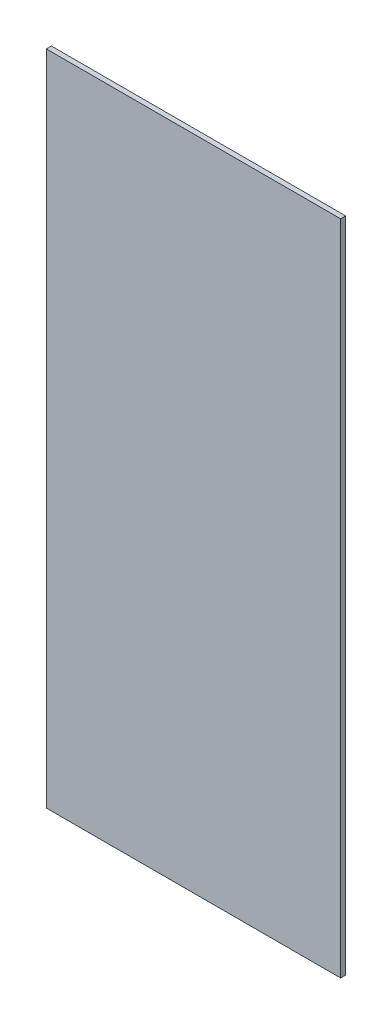
ISO-10303-21;
HEADER;
FILE_DESCRIPTION(('STEP AP214'),'2;1');
FILE_NAME('part.step','',(''),(''),'','','');
FILE_SCHEMA(('AUTOMOTIVE_DESIGN { 1 0 10303 214 1 1 1 1 }'));
ENDSEC;
DATA;
#1=APPLICATION_CONTEXT('core data for automotive mechanical design processes');
#2=APPLICATION_PROTOCOL_DEFINITION('international standard','automotive_design',2000,#1);
#3=PRODUCT_CONTEXT('',#1,'mechanical');
#4=PRODUCT('Part','Part','',(#3));
#5=PRODUCT_RELATED_PRODUCT_CATEGORY('part','',(#4));
#6=PRODUCT_DEFINITION_FORMATION('','',#4);
#7=PRODUCT_DEFINITION_CONTEXT('part definition',#1,'design');
#8=PRODUCT_DEFINITION('design','',#6,#7);
#9=PRODUCT_DEFINITION_SHAPE('','',#8);
#10=(LENGTH_UNIT() NAMED_UNIT(*) SI_UNIT(.MILLI.,.METRE.));
#11=(NAMED_UNIT(*) PLANE_ANGLE_UNIT() SI_UNIT($,.RADIAN.));
#12=(NAMED_UNIT(*) SI_UNIT($,.STERADIAN.) SOLID_ANGLE_UNIT());
#13=UNCERTAINTY_MEASURE_WITH_UNIT(LENGTH_MEASURE(1.E-05),#10,'distance_accuracy_value','');
#14=(GEOMETRIC_REPRESENTATION_CONTEXT(3) GLOBAL_UNCERTAINTY_ASSIGNED_CONTEXT((#13)) GLOBAL_UNIT_ASSIGNED_CONTEXT((#10,
#11,#12)) REPRESENTATION_CONTEXT('',''));
#15=CARTESIAN_POINT('',(0.,0.,0.));
#16=DIRECTION('',(0.,0.,1.));
#17=DIRECTION('',(1.,0.,0.));
#18=AXIS2_PLACEMENT_3D('',#15,#16,#17);
#19=CARTESIAN_POINT('',(-117.5,262.5,4.));
#20=DIRECTION('',(1.,0.,0.));
#21=DIRECTION('',(0.,1.,0.));
#22=AXIS2_PLACEMENT_3D('',#19,#20,#21);
#23=PLANE('',#22);
#24=DIRECTION('',(0.,-1.,0.));
#25=VECTOR('',#24,1.);
#26=CARTESIAN_POINT('',(-117.5,262.5,0.));
#27=LINE('',#26,#25);
#28=CARTESIAN_POINT('',(-117.5,262.5,0.));
#29=VERTEX_POINT('',#28);
#30=CARTESIAN_POINT('',(-117.5,-262.5,0.));
#31=VERTEX_POINT('',#30);
#32=EDGE_CURVE('E91',#29,#31,#27,.T.);
#33=ORIENTED_EDGE('',*,*,#32,.T.);
#34=DIRECTION('',(0.,0.,-1.));
#35=VECTOR('',#34,1.);
#36=CARTESIAN_POINT('',(-117.5,-262.5,4.));
#37=LINE('',#36,#35);
#38=CARTESIAN_POINT('',(-117.5,-262.5,4.));
#39=VERTEX_POINT('',#38);
#40=EDGE_CURVE('E11',#39,#31,#37,.T.);
#41=ORIENTED_EDGE('',*,*,#40,.F.);
#42=DIRECTION('',(0.,-1.,0.));
#43=VECTOR('',#42,1.);
#44=CARTESIAN_POINT('',(-117.5,262.5,4.));
#45=LINE('',#44,#43);
#46=CARTESIAN_POINT('',(-117.5,262.5,4.));
#47=VERTEX_POINT('',#46);
#48=EDGE_CURVE('E79',#47,#39,#45,.T.);
#49=ORIENTED_EDGE('',*,*,#48,.F.);
#50=DIRECTION('',(0.,0.,-1.));
#51=VECTOR('',#50,1.);
#52=CARTESIAN_POINT('',(-117.5,262.5,4.));
#53=LINE('',#52,#51);
#54=EDGE_CURVE('E87',#47,#29,#53,.T.);
#55=ORIENTED_EDGE('',*,*,#54,.T.);
#56=EDGE_LOOP('',(#33,#41,#49,#55));
#57=FACE_BOUND('',#56,.T.);
#58=ADVANCED_FACE('F28',(#57),#23,.F.);
#59=CARTESIAN_POINT('',(-117.5,-262.5,4.));
#60=DIRECTION('',(0.,1.,0.));
#61=DIRECTION('',(0.,0.,1.));
#62=AXIS2_PLACEMENT_3D('',#59,#60,#61);
#63=PLANE('',#62);
#64=DIRECTION('',(1.,0.,0.));
#65=VECTOR('',#64,1.);
#66=CARTESIAN_POINT('',(-117.5,-262.5,0.));
#67=LINE('',#66,#65);
#68=CARTESIAN_POINT('',(117.5,-262.5,0.));
#69=VERTEX_POINT('',#68);
#70=EDGE_CURVE('E83',#31,#69,#67,.T.);
#71=ORIENTED_EDGE('',*,*,#70,.T.);
#72=DIRECTION('',(0.,0.,-1.));
#73=VECTOR('',#72,1.);
#74=CARTESIAN_POINT('',(117.5,-262.5,4.));
#75=LINE('',#74,#73);
#76=CARTESIAN_POINT('',(117.5,-262.5,4.));
#77=VERTEX_POINT('',#76);
#78=EDGE_CURVE('E36',#77,#69,#75,.T.);
#79=ORIENTED_EDGE('',*,*,#78,.F.);
#80=DIRECTION('',(1.,0.,0.));
#81=VECTOR('',#80,1.);
#82=CARTESIAN_POINT('',(-117.5,-262.5,4.));
#83=LINE('',#82,#81);
#84=EDGE_CURVE('E74',#39,#77,#83,.T.);
#85=ORIENTED_EDGE('',*,*,#84,.F.);
#86=ORIENTED_EDGE('',*,*,#40,.T.);
#87=EDGE_LOOP('',(#71,#79,#85,#86));
#88=FACE_BOUND('',#87,.T.);
#89=ADVANCED_FACE('F82',(#88),#63,.F.);
#90=CARTESIAN_POINT('',(117.5,262.5,4.));
#91=DIRECTION('',(-1.,0.,0.));
#92=DIRECTION('',(0.,-1.,0.));
#93=AXIS2_PLACEMENT_3D('',#90,#91,#92);
#94=PLANE('',#93);
#95=DIRECTION('',(0.,1.,0.));
#96=VECTOR('',#95,1.);
#97=CARTESIAN_POINT('',(117.5,262.5,0.));
#98=LINE('',#97,#96);
#99=CARTESIAN_POINT('',(117.5,262.5,0.));
#100=VERTEX_POINT('',#99);
#101=EDGE_CURVE('E61',#69,#100,#98,.T.);
#102=ORIENTED_EDGE('',*,*,#101,.T.);
#103=DIRECTION('',(0.,0.,-1.));
#104=VECTOR('',#103,1.);
#105=CARTESIAN_POINT('',(117.5,262.5,4.));
#106=LINE('',#105,#104);
#107=CARTESIAN_POINT('',(117.5,262.5,4.));
#108=VERTEX_POINT('',#107);
#109=EDGE_CURVE('E84',#108,#100,#106,.T.);
#110=ORIENTED_EDGE('',*,*,#109,.F.);
#111=DIRECTION('',(0.,1.,0.));
#112=VECTOR('',#111,1.);
#113=CARTESIAN_POINT('',(117.5,262.5,4.));
#114=LINE('',#113,#112);
#115=EDGE_CURVE('E77',#77,#108,#114,.T.);
#116=ORIENTED_EDGE('',*,*,#115,.F.);
#117=ORIENTED_EDGE('',*,*,#78,.T.);
#118=EDGE_LOOP('',(#102,#110,#116,#117));
#119=FACE_BOUND('',#118,.T.);
#120=ADVANCED_FACE('F85',(#119),#94,.F.);
#121=CARTESIAN_POINT('',(-117.5,262.5,4.));
#122=DIRECTION('',(0.,-1.,0.));
#123=DIRECTION('',(0.,0.,-1.));
#124=AXIS2_PLACEMENT_3D('',#121,#122,#123);
#125=PLANE('',#124);
#126=DIRECTION('',(-1.,0.,0.));
#127=VECTOR('',#126,1.);
#128=CARTESIAN_POINT('',(-117.5,262.5,0.));
#129=LINE('',#128,#127);
#130=EDGE_CURVE('E67',#100,#29,#129,.T.);
#131=ORIENTED_EDGE('',*,*,#130,.T.);
#132=ORIENTED_EDGE('',*,*,#54,.F.);
#133=DIRECTION('',(-1.,0.,0.));
#134=VECTOR('',#133,1.);
#135=CARTESIAN_POINT('',(-117.5,262.5,4.));
#136=LINE('',#135,#134);
#137=EDGE_CURVE('E44',#108,#47,#136,.T.);
#138=ORIENTED_EDGE('',*,*,#137,.F.);
#139=ORIENTED_EDGE('',*,*,#109,.T.);
#140=EDGE_LOOP('',(#131,#132,#138,#139));
#141=FACE_BOUND('',#140,.T.);
#142=ADVANCED_FACE('F98',(#141),#125,.F.);
#143=CARTESIAN_POINT('',(0.,0.,4.));
#144=DIRECTION('',(0.,0.,1.));
#145=DIRECTION('',(1.,0.,0.));
#146=AXIS2_PLACEMENT_3D('',#143,#144,#145);
#147=PLANE('',#146);
#148=ORIENTED_EDGE('',*,*,#48,.T.);
#149=ORIENTED_EDGE('',*,*,#84,.T.);
#150=ORIENTED_EDGE('',*,*,#115,.T.);
#151=ORIENTED_EDGE('',*,*,#137,.T.);
#152=EDGE_LOOP('',(#148,#149,#150,#151));
#153=FACE_BOUND('',#152,.T.);
#154=ADVANCED_FACE('F75',(#153),#147,.T.);
#155=CARTESIAN_POINT('',(0.,0.,0.));
#156=DIRECTION('',(0.,0.,1.));
#157=DIRECTION('',(1.,0.,0.));
#158=AXIS2_PLACEMENT_3D('',#155,#156,#157);
#159=PLANE('',#158);
#160=ORIENTED_EDGE('',*,*,#32,.F.);
#161=ORIENTED_EDGE('',*,*,#130,.F.);
#162=ORIENTED_EDGE('',*,*,#101,.F.);
#163=ORIENTED_EDGE('',*,*,#70,.F.);
#164=EDGE_LOOP('',(#160,#161,#162,#163));
#165=FACE_BOUND('',#164,.T.);
#166=ADVANCED_FACE('F101',(#165),#159,.F.);
#167=CLOSED_SHELL('',(#58,#89,#120,#142,#154,#166));
#168=MANIFOLD_SOLID_BREP('B2',#167);
#169=ADVANCED_BREP_SHAPE_REPRESENTATION('',(#18,#168),#14);
#170=SHAPE_DEFINITION_REPRESENTATION(#9,#169);
ENDSEC;
END-ISO-10303-21;
